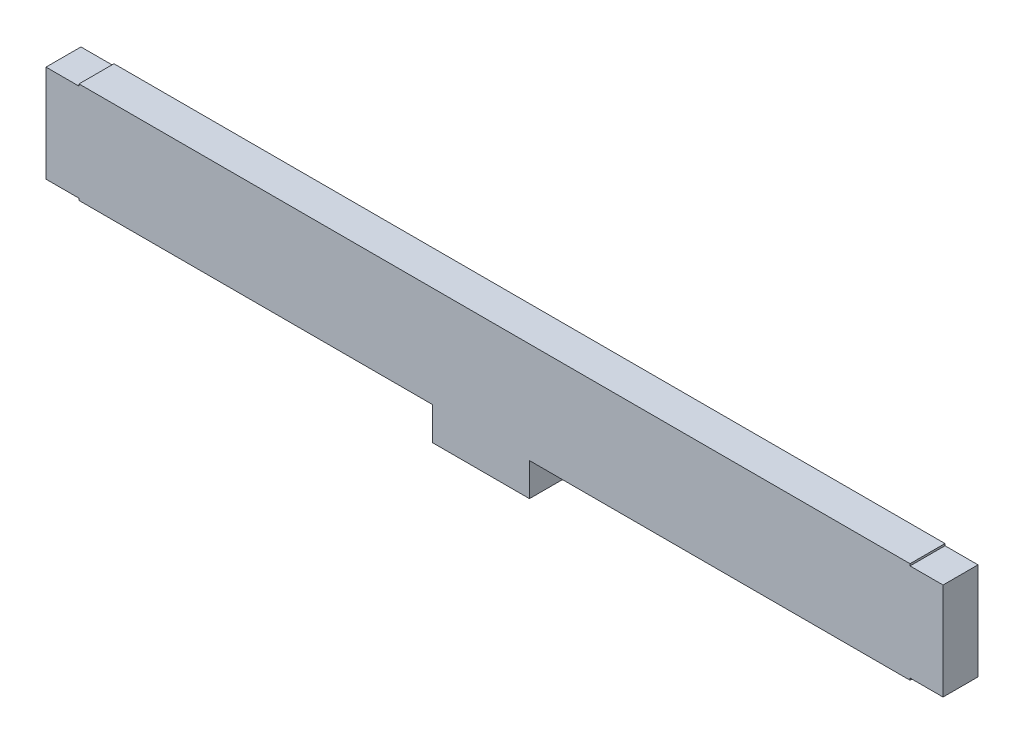
ISO-10303-21;
HEADER;
FILE_DESCRIPTION(('STEP AP214'),'2;1');
FILE_NAME('part.step','',(''),(''),'','','');
FILE_SCHEMA(('AUTOMOTIVE_DESIGN { 1 0 10303 214 1 1 1 1 }'));
ENDSEC;
DATA;
#1=APPLICATION_CONTEXT('core data for automotive mechanical design processes');
#2=APPLICATION_PROTOCOL_DEFINITION('international standard','automotive_design',2000,#1);
#3=PRODUCT_CONTEXT('',#1,'mechanical');
#4=PRODUCT('Part','Part','',(#3));
#5=PRODUCT_RELATED_PRODUCT_CATEGORY('part','',(#4));
#6=PRODUCT_DEFINITION_FORMATION('','',#4);
#7=PRODUCT_DEFINITION_CONTEXT('part definition',#1,'design');
#8=PRODUCT_DEFINITION('design','',#6,#7);
#9=PRODUCT_DEFINITION_SHAPE('','',#8);
#10=(LENGTH_UNIT() NAMED_UNIT(*) SI_UNIT(.MILLI.,.METRE.));
#11=(NAMED_UNIT(*) PLANE_ANGLE_UNIT() SI_UNIT($,.RADIAN.));
#12=(NAMED_UNIT(*) SI_UNIT($,.STERADIAN.) SOLID_ANGLE_UNIT());
#13=UNCERTAINTY_MEASURE_WITH_UNIT(LENGTH_MEASURE(1.E-05),#10,'distance_accuracy_value','');
#14=(GEOMETRIC_REPRESENTATION_CONTEXT(3) GLOBAL_UNCERTAINTY_ASSIGNED_CONTEXT((#13)) GLOBAL_UNIT_ASSIGNED_CONTEXT((#10,
#11,#12)) REPRESENTATION_CONTEXT('',''));
#15=CARTESIAN_POINT('',(0.,0.,0.));
#16=DIRECTION('',(0.,0.,1.));
#17=DIRECTION('',(1.,0.,0.));
#18=AXIS2_PLACEMENT_3D('',#15,#16,#17);
#19=CARTESIAN_POINT('',(0.,0.,18.));
#20=DIRECTION('',(1.,0.,0.));
#21=DIRECTION('',(0.,0.,-1.));
#22=AXIS2_PLACEMENT_3D('',#19,#20,#21);
#23=PLANE('',#22);
#24=DIRECTION('',(0.,-1.,0.));
#25=VECTOR('',#24,1.);
#26=CARTESIAN_POINT('',(0.,0.,0.));
#27=LINE('',#26,#25);
#28=CARTESIAN_POINT('',(0.,0.,0.));
#29=VERTEX_POINT('',#28);
#30=CARTESIAN_POINT('',(0.,-1.00000000000005,0.));
#31=VERTEX_POINT('',#30);
#32=EDGE_CURVE('E179',#29,#31,#27,.T.);
#33=ORIENTED_EDGE('',*,*,#32,.T.);
#34=DIRECTION('',(0.,0.,-1.));
#35=VECTOR('',#34,1.);
#36=CARTESIAN_POINT('',(0.,-1.00000000000005,18.));
#37=LINE('',#36,#35);
#38=CARTESIAN_POINT('',(0.,-1.00000000000005,18.));
#39=VERTEX_POINT('',#38);
#40=EDGE_CURVE('E11',#39,#31,#37,.T.);
#41=ORIENTED_EDGE('',*,*,#40,.F.);
#42=DIRECTION('',(0.,-1.,0.));
#43=VECTOR('',#42,1.);
#44=CARTESIAN_POINT('',(0.,0.,18.));
#45=LINE('',#44,#43);
#46=CARTESIAN_POINT('',(0.,0.,18.));
#47=VERTEX_POINT('',#46);
#48=EDGE_CURVE('E209',#47,#39,#45,.T.);
#49=ORIENTED_EDGE('',*,*,#48,.F.);
#50=DIRECTION('',(0.,0.,-1.));
#51=VECTOR('',#50,1.);
#52=CARTESIAN_POINT('',(0.,0.,18.));
#53=LINE('',#52,#51);
#54=EDGE_CURVE('E175',#47,#29,#53,.T.);
#55=ORIENTED_EDGE('',*,*,#54,.T.);
#56=EDGE_LOOP('',(#33,#41,#49,#55));
#57=FACE_BOUND('',#56,.T.);
#58=ADVANCED_FACE('F35',(#57),#23,.F.);
#59=CARTESIAN_POINT('',(-17.,-1.00000000000005,18.));
#60=DIRECTION('',(0.,-1.,0.));
#61=DIRECTION('',(0.,0.,-1.));
#62=AXIS2_PLACEMENT_3D('',#59,#60,#61);
#63=PLANE('',#62);
#64=DIRECTION('',(-1.,0.,0.));
#65=VECTOR('',#64,1.);
#66=CARTESIAN_POINT('',(-17.,-1.00000000000005,0.));
#67=LINE('',#66,#65);
#68=CARTESIAN_POINT('',(-17.,-1.00000000000005,0.));
#69=VERTEX_POINT('',#68);
#70=EDGE_CURVE('E182',#31,#69,#67,.T.);
#71=ORIENTED_EDGE('',*,*,#70,.T.);
#72=DIRECTION('',(0.,0.,-1.));
#73=VECTOR('',#72,1.);
#74=CARTESIAN_POINT('',(-17.,-1.00000000000005,18.));
#75=LINE('',#74,#73);
#76=CARTESIAN_POINT('',(-17.,-1.00000000000005,18.));
#77=VERTEX_POINT('',#76);
#78=EDGE_CURVE('E43',#77,#69,#75,.T.);
#79=ORIENTED_EDGE('',*,*,#78,.F.);
#80=DIRECTION('',(-1.,0.,0.));
#81=VECTOR('',#80,1.);
#82=CARTESIAN_POINT('',(-17.,-1.00000000000005,18.));
#83=LINE('',#82,#81);
#84=EDGE_CURVE('E118',#39,#77,#83,.T.);
#85=ORIENTED_EDGE('',*,*,#84,.F.);
#86=ORIENTED_EDGE('',*,*,#40,.T.);
#87=EDGE_LOOP('',(#71,#79,#85,#86));
#88=FACE_BOUND('',#87,.T.);
#89=ADVANCED_FACE('F307',(#88),#63,.F.);
#90=CARTESIAN_POINT('',(-17.,-1.00000000000005,18.));
#91=DIRECTION('',(1.,0.,0.));
#92=DIRECTION('',(0.,1.,0.));
#93=AXIS2_PLACEMENT_3D('',#90,#91,#92);
#94=PLANE('',#93);
#95=DIRECTION('',(0.,-1.,0.));
#96=VECTOR('',#95,1.);
#97=CARTESIAN_POINT('',(-17.,-1.00000000000005,0.));
#98=LINE('',#97,#96);
#99=CARTESIAN_POINT('',(-17.,-51.0000000000001,0.));
#100=VERTEX_POINT('',#99);
#101=EDGE_CURVE('E184',#69,#100,#98,.T.);
#102=ORIENTED_EDGE('',*,*,#101,.T.);
#103=DIRECTION('',(0.,0.,-1.));
#104=VECTOR('',#103,1.);
#105=CARTESIAN_POINT('',(-17.,-51.0000000000001,18.));
#106=LINE('',#105,#104);
#107=CARTESIAN_POINT('',(-17.,-51.0000000000001,18.));
#108=VERTEX_POINT('',#107);
#109=EDGE_CURVE('E240',#108,#100,#106,.T.);
#110=ORIENTED_EDGE('',*,*,#109,.F.);
#111=DIRECTION('',(0.,-1.,0.));
#112=VECTOR('',#111,1.);
#113=CARTESIAN_POINT('',(-17.,-1.00000000000005,18.));
#114=LINE('',#113,#112);
#115=EDGE_CURVE('E248',#77,#108,#114,.T.);
#116=ORIENTED_EDGE('',*,*,#115,.F.);
#117=ORIENTED_EDGE('',*,*,#78,.T.);
#118=EDGE_LOOP('',(#102,#110,#116,#117));
#119=FACE_BOUND('',#118,.T.);
#120=ADVANCED_FACE('F246',(#119),#94,.F.);
#121=CARTESIAN_POINT('',(-17.,-51.0000000000001,18.));
#122=DIRECTION('',(0.,1.,0.));
#123=DIRECTION('',(0.,0.,1.));
#124=AXIS2_PLACEMENT_3D('',#121,#122,#123);
#125=PLANE('',#124);
#126=DIRECTION('',(1.,0.,0.));
#127=VECTOR('',#126,1.);
#128=CARTESIAN_POINT('',(-17.,-51.0000000000001,0.));
#129=LINE('',#128,#127);
#130=CARTESIAN_POINT('',(0.,-51.0000000000001,0.));
#131=VERTEX_POINT('',#130);
#132=EDGE_CURVE('E186',#100,#131,#129,.T.);
#133=ORIENTED_EDGE('',*,*,#132,.T.);
#134=DIRECTION('',(0.,0.,-1.));
#135=VECTOR('',#134,1.);
#136=CARTESIAN_POINT('',(0.,-51.0000000000001,18.));
#137=LINE('',#136,#135);
#138=CARTESIAN_POINT('',(0.,-51.0000000000001,18.));
#139=VERTEX_POINT('',#138);
#140=EDGE_CURVE('E237',#139,#131,#137,.T.);
#141=ORIENTED_EDGE('',*,*,#140,.F.);
#142=DIRECTION('',(1.,0.,0.));
#143=VECTOR('',#142,1.);
#144=CARTESIAN_POINT('',(-17.,-51.0000000000001,18.));
#145=LINE('',#144,#143);
#146=EDGE_CURVE('E266',#108,#139,#145,.T.);
#147=ORIENTED_EDGE('',*,*,#146,.F.);
#148=ORIENTED_EDGE('',*,*,#109,.T.);
#149=EDGE_LOOP('',(#133,#141,#147,#148));
#150=FACE_BOUND('',#149,.T.);
#151=ADVANCED_FACE('F257',(#150),#125,.F.);
#152=CARTESIAN_POINT('',(0.,-51.0000000000001,18.));
#153=DIRECTION('',(1.,0.,0.));
#154=DIRECTION('',(0.,1.,0.));
#155=AXIS2_PLACEMENT_3D('',#152,#153,#154);
#156=PLANE('',#155);
#157=DIRECTION('',(0.,-1.,0.));
#158=VECTOR('',#157,1.);
#159=CARTESIAN_POINT('',(0.,-51.0000000000001,0.));
#160=LINE('',#159,#158);
#161=CARTESIAN_POINT('',(0.,-52.,0.));
#162=VERTEX_POINT('',#161);
#163=EDGE_CURVE('E188',#131,#162,#160,.T.);
#164=ORIENTED_EDGE('',*,*,#163,.T.);
#165=DIRECTION('',(0.,0.,-1.));
#166=VECTOR('',#165,1.);
#167=CARTESIAN_POINT('',(0.,-52.,18.));
#168=LINE('',#167,#166);
#169=CARTESIAN_POINT('',(0.,-52.,18.));
#170=VERTEX_POINT('',#169);
#171=EDGE_CURVE('E234',#170,#162,#168,.T.);
#172=ORIENTED_EDGE('',*,*,#171,.F.);
#173=DIRECTION('',(0.,-1.,0.));
#174=VECTOR('',#173,1.);
#175=CARTESIAN_POINT('',(0.,-51.0000000000001,18.));
#176=LINE('',#175,#174);
#177=EDGE_CURVE('E263',#139,#170,#176,.T.);
#178=ORIENTED_EDGE('',*,*,#177,.F.);
#179=ORIENTED_EDGE('',*,*,#140,.T.);
#180=EDGE_LOOP('',(#164,#172,#178,#179));
#181=FACE_BOUND('',#180,.T.);
#182=ADVANCED_FACE('F261',(#181),#156,.F.);
#183=CARTESIAN_POINT('',(182.,-52.,18.));
#184=DIRECTION('',(0.,1.,0.));
#185=DIRECTION('',(-1.,0.,0.));
#186=AXIS2_PLACEMENT_3D('',#183,#184,#185);
#187=PLANE('',#186);
#188=DIRECTION('',(1.,0.,0.));
#189=VECTOR('',#188,1.);
#190=CARTESIAN_POINT('',(182.,-52.,0.));
#191=LINE('',#190,#189);
#192=CARTESIAN_POINT('',(182.,-52.,0.));
#193=VERTEX_POINT('',#192);
#194=EDGE_CURVE('E190',#162,#193,#191,.T.);
#195=ORIENTED_EDGE('',*,*,#194,.T.);
#196=DIRECTION('',(0.,0.,-1.));
#197=VECTOR('',#196,1.);
#198=CARTESIAN_POINT('',(182.,-52.,18.));
#199=LINE('',#198,#197);
#200=CARTESIAN_POINT('',(182.,-52.,18.));
#201=VERTEX_POINT('',#200);
#202=EDGE_CURVE('E231',#201,#193,#199,.T.);
#203=ORIENTED_EDGE('',*,*,#202,.F.);
#204=DIRECTION('',(1.,0.,0.));
#205=VECTOR('',#204,1.);
#206=CARTESIAN_POINT('',(182.,-52.,18.));
#207=LINE('',#206,#205);
#208=EDGE_CURVE('E265',#170,#201,#207,.T.);
#209=ORIENTED_EDGE('',*,*,#208,.F.);
#210=ORIENTED_EDGE('',*,*,#171,.T.);
#211=EDGE_LOOP('',(#195,#203,#209,#210));
#212=FACE_BOUND('',#211,.T.);
#213=ADVANCED_FACE('F320',(#212),#187,.F.);
#214=CARTESIAN_POINT('',(182.,-52.,18.));
#215=DIRECTION('',(1.,0.,0.));
#216=DIRECTION('',(0.,1.,0.));
#217=AXIS2_PLACEMENT_3D('',#214,#215,#216);
#218=PLANE('',#217);
#219=DIRECTION('',(0.,-1.,0.));
#220=VECTOR('',#219,1.);
#221=CARTESIAN_POINT('',(182.,-52.,0.));
#222=LINE('',#221,#220);
#223=CARTESIAN_POINT('',(182.,-68.9999999999999,0.));
#224=VERTEX_POINT('',#223);
#225=EDGE_CURVE('E192',#193,#224,#222,.T.);
#226=ORIENTED_EDGE('',*,*,#225,.T.);
#227=DIRECTION('',(0.,0.,-1.));
#228=VECTOR('',#227,1.);
#229=CARTESIAN_POINT('',(182.,-68.9999999999999,18.));
#230=LINE('',#229,#228);
#231=CARTESIAN_POINT('',(182.,-68.9999999999999,18.));
#232=VERTEX_POINT('',#231);
#233=EDGE_CURVE('E228',#232,#224,#230,.T.);
#234=ORIENTED_EDGE('',*,*,#233,.F.);
#235=DIRECTION('',(0.,-1.,0.));
#236=VECTOR('',#235,1.);
#237=CARTESIAN_POINT('',(182.,-52.,18.));
#238=LINE('',#237,#236);
#239=EDGE_CURVE('E268',#201,#232,#238,.T.);
#240=ORIENTED_EDGE('',*,*,#239,.F.);
#241=ORIENTED_EDGE('',*,*,#202,.T.);
#242=EDGE_LOOP('',(#226,#234,#240,#241));
#243=FACE_BOUND('',#242,.T.);
#244=ADVANCED_FACE('F323',(#243),#218,.F.);
#245=CARTESIAN_POINT('',(182.,-68.9999999999999,18.));
#246=DIRECTION('',(0.,1.,0.));
#247=DIRECTION('',(0.,0.,1.));
#248=AXIS2_PLACEMENT_3D('',#245,#246,#247);
#249=PLANE('',#248);
#250=DIRECTION('',(1.,0.,0.));
#251=VECTOR('',#250,1.);
#252=CARTESIAN_POINT('',(182.,-68.9999999999999,0.));
#253=LINE('',#252,#251);
#254=CARTESIAN_POINT('',(232.,-68.9999999999999,0.));
#255=VERTEX_POINT('',#254);
#256=EDGE_CURVE('E194',#224,#255,#253,.T.);
#257=ORIENTED_EDGE('',*,*,#256,.T.);
#258=DIRECTION('',(0.,0.,-1.));
#259=VECTOR('',#258,1.);
#260=CARTESIAN_POINT('',(232.,-68.9999999999999,18.));
#261=LINE('',#260,#259);
#262=CARTESIAN_POINT('',(232.,-68.9999999999999,18.));
#263=VERTEX_POINT('',#262);
#264=EDGE_CURVE('E225',#263,#255,#261,.T.);
#265=ORIENTED_EDGE('',*,*,#264,.F.);
#266=DIRECTION('',(1.,0.,0.));
#267=VECTOR('',#266,1.);
#268=CARTESIAN_POINT('',(182.,-68.9999999999999,18.));
#269=LINE('',#268,#267);
#270=EDGE_CURVE('E274',#232,#263,#269,.T.);
#271=ORIENTED_EDGE('',*,*,#270,.F.);
#272=ORIENTED_EDGE('',*,*,#233,.T.);
#273=EDGE_LOOP('',(#257,#265,#271,#272));
#274=FACE_BOUND('',#273,.T.);
#275=ADVANCED_FACE('F327',(#274),#249,.F.);
#276=CARTESIAN_POINT('',(232.,-52.,18.));
#277=DIRECTION('',(-1.,0.,0.));
#278=DIRECTION('',(0.,0.,1.));
#279=AXIS2_PLACEMENT_3D('',#276,#277,#278);
#280=PLANE('',#279);
#281=DIRECTION('',(0.,1.,0.));
#282=VECTOR('',#281,1.);
#283=CARTESIAN_POINT('',(232.,-52.,0.));
#284=LINE('',#283,#282);
#285=CARTESIAN_POINT('',(232.,-52.,0.));
#286=VERTEX_POINT('',#285);
#287=EDGE_CURVE('E196',#255,#286,#284,.T.);
#288=ORIENTED_EDGE('',*,*,#287,.T.);
#289=DIRECTION('',(0.,0.,-1.));
#290=VECTOR('',#289,1.);
#291=CARTESIAN_POINT('',(232.,-52.,18.));
#292=LINE('',#291,#290);
#293=CARTESIAN_POINT('',(232.,-52.,18.));
#294=VERTEX_POINT('',#293);
#295=EDGE_CURVE('E222',#294,#286,#292,.T.);
#296=ORIENTED_EDGE('',*,*,#295,.F.);
#297=DIRECTION('',(0.,1.,0.));
#298=VECTOR('',#297,1.);
#299=CARTESIAN_POINT('',(232.,-52.,18.));
#300=LINE('',#299,#298);
#301=EDGE_CURVE('E276',#263,#294,#300,.T.);
#302=ORIENTED_EDGE('',*,*,#301,.F.);
#303=ORIENTED_EDGE('',*,*,#264,.T.);
#304=EDGE_LOOP('',(#288,#296,#302,#303));
#305=FACE_BOUND('',#304,.T.);
#306=ADVANCED_FACE('F331',(#305),#280,.F.);
#307=CARTESIAN_POINT('',(428.,-51.9999999999999,18.));
#308=DIRECTION('',(0.,1.,0.));
#309=DIRECTION('',(-1.,0.,0.));
#310=AXIS2_PLACEMENT_3D('',#307,#308,#309);
#311=PLANE('',#310);
#312=DIRECTION('',(1.,0.,0.));
#313=VECTOR('',#312,1.);
#314=CARTESIAN_POINT('',(428.,-51.9999999999999,0.));
#315=LINE('',#314,#313);
#316=CARTESIAN_POINT('',(428.,-51.9999999999999,0.));
#317=VERTEX_POINT('',#316);
#318=EDGE_CURVE('E198',#286,#317,#315,.T.);
#319=ORIENTED_EDGE('',*,*,#318,.T.);
#320=DIRECTION('',(0.,0.,-1.));
#321=VECTOR('',#320,1.);
#322=CARTESIAN_POINT('',(428.,-51.9999999999999,18.));
#323=LINE('',#322,#321);
#324=CARTESIAN_POINT('',(428.,-51.9999999999999,18.));
#325=VERTEX_POINT('',#324);
#326=EDGE_CURVE('E219',#325,#317,#323,.T.);
#327=ORIENTED_EDGE('',*,*,#326,.F.);
#328=DIRECTION('',(1.,0.,0.));
#329=VECTOR('',#328,1.);
#330=CARTESIAN_POINT('',(428.,-51.9999999999999,18.));
#331=LINE('',#330,#329);
#332=EDGE_CURVE('E278',#294,#325,#331,.T.);
#333=ORIENTED_EDGE('',*,*,#332,.F.);
#334=ORIENTED_EDGE('',*,*,#295,.T.);
#335=EDGE_LOOP('',(#319,#327,#333,#334));
#336=FACE_BOUND('',#335,.T.);
#337=ADVANCED_FACE('F335',(#336),#311,.F.);
#338=CARTESIAN_POINT('',(428.,-51.,18.));
#339=DIRECTION('',(-1.,0.,0.));
#340=DIRECTION('',(0.,0.,1.));
#341=AXIS2_PLACEMENT_3D('',#338,#339,#340);
#342=PLANE('',#341);
#343=DIRECTION('',(0.,1.,0.));
#344=VECTOR('',#343,1.);
#345=CARTESIAN_POINT('',(428.,-51.,0.));
#346=LINE('',#345,#344);
#347=CARTESIAN_POINT('',(428.,-51.,0.));
#348=VERTEX_POINT('',#347);
#349=EDGE_CURVE('E200',#317,#348,#346,.T.);
#350=ORIENTED_EDGE('',*,*,#349,.T.);
#351=DIRECTION('',(0.,0.,-1.));
#352=VECTOR('',#351,1.);
#353=CARTESIAN_POINT('',(428.,-51.,18.));
#354=LINE('',#353,#352);
#355=CARTESIAN_POINT('',(428.,-51.,18.));
#356=VERTEX_POINT('',#355);
#357=EDGE_CURVE('E216',#356,#348,#354,.T.);
#358=ORIENTED_EDGE('',*,*,#357,.F.);
#359=DIRECTION('',(0.,1.,0.));
#360=VECTOR('',#359,1.);
#361=CARTESIAN_POINT('',(428.,-51.,18.));
#362=LINE('',#361,#360);
#363=EDGE_CURVE('E280',#325,#356,#362,.T.);
#364=ORIENTED_EDGE('',*,*,#363,.F.);
#365=ORIENTED_EDGE('',*,*,#326,.T.);
#366=EDGE_LOOP('',(#350,#358,#364,#365));
#367=FACE_BOUND('',#366,.T.);
#368=ADVANCED_FACE('F339',(#367),#342,.F.);
#369=CARTESIAN_POINT('',(445.,-51.,18.));
#370=DIRECTION('',(0.,1.,0.));
#371=DIRECTION('',(0.,0.,1.));
#372=AXIS2_PLACEMENT_3D('',#369,#370,#371);
#373=PLANE('',#372);
#374=DIRECTION('',(1.,0.,0.));
#375=VECTOR('',#374,1.);
#376=CARTESIAN_POINT('',(445.,-51.,0.));
#377=LINE('',#376,#375);
#378=CARTESIAN_POINT('',(445.,-51.,0.));
#379=VERTEX_POINT('',#378);
#380=EDGE_CURVE('E202',#348,#379,#377,.T.);
#381=ORIENTED_EDGE('',*,*,#380,.T.);
#382=DIRECTION('',(0.,0.,-1.));
#383=VECTOR('',#382,1.);
#384=CARTESIAN_POINT('',(445.,-51.,18.));
#385=LINE('',#384,#383);
#386=CARTESIAN_POINT('',(445.,-51.,18.));
#387=VERTEX_POINT('',#386);
#388=EDGE_CURVE('E213',#387,#379,#385,.T.);
#389=ORIENTED_EDGE('',*,*,#388,.F.);
#390=DIRECTION('',(1.,0.,0.));
#391=VECTOR('',#390,1.);
#392=CARTESIAN_POINT('',(445.,-51.,18.));
#393=LINE('',#392,#391);
#394=EDGE_CURVE('E282',#356,#387,#393,.T.);
#395=ORIENTED_EDGE('',*,*,#394,.F.);
#396=ORIENTED_EDGE('',*,*,#357,.T.);
#397=EDGE_LOOP('',(#381,#389,#395,#396));
#398=FACE_BOUND('',#397,.T.);
#399=ADVANCED_FACE('F288',(#398),#373,.F.);
#400=CARTESIAN_POINT('',(445.,-0.999999999999997,18.));
#401=DIRECTION('',(-1.,0.,0.));
#402=DIRECTION('',(0.,-1.,0.));
#403=AXIS2_PLACEMENT_3D('',#400,#401,#402);
#404=PLANE('',#403);
#405=DIRECTION('',(0.,1.,0.));
#406=VECTOR('',#405,1.);
#407=CARTESIAN_POINT('',(445.,-0.999999999999997,0.));
#408=LINE('',#407,#406);
#409=CARTESIAN_POINT('',(445.,-0.999999999999997,0.));
#410=VERTEX_POINT('',#409);
#411=EDGE_CURVE('E204',#379,#410,#408,.T.);
#412=ORIENTED_EDGE('',*,*,#411,.T.);
#413=DIRECTION('',(0.,0.,-1.));
#414=VECTOR('',#413,1.);
#415=CARTESIAN_POINT('',(445.,-0.999999999999997,18.));
#416=LINE('',#415,#414);
#417=CARTESIAN_POINT('',(445.,-0.999999999999997,18.));
#418=VERTEX_POINT('',#417);
#419=EDGE_CURVE('E170',#418,#410,#416,.T.);
#420=ORIENTED_EDGE('',*,*,#419,.F.);
#421=DIRECTION('',(0.,1.,0.));
#422=VECTOR('',#421,1.);
#423=CARTESIAN_POINT('',(445.,-0.999999999999997,18.));
#424=LINE('',#423,#422);
#425=EDGE_CURVE('E161',#387,#418,#424,.T.);
#426=ORIENTED_EDGE('',*,*,#425,.F.);
#427=ORIENTED_EDGE('',*,*,#388,.T.);
#428=EDGE_LOOP('',(#412,#420,#426,#427));
#429=FACE_BOUND('',#428,.T.);
#430=ADVANCED_FACE('F292',(#429),#404,.F.);
#431=CARTESIAN_POINT('',(445.,-0.999999999999997,18.));
#432=DIRECTION('',(0.,-1.,0.));
#433=DIRECTION('',(1.,0.,0.));
#434=AXIS2_PLACEMENT_3D('',#431,#432,#433);
#435=PLANE('',#434);
#436=DIRECTION('',(-1.,0.,0.));
#437=VECTOR('',#436,1.);
#438=CARTESIAN_POINT('',(445.,-0.999999999999997,0.));
#439=LINE('',#438,#437);
#440=CARTESIAN_POINT('',(428.,-1.,0.));
#441=VERTEX_POINT('',#440);
#442=EDGE_CURVE('E169',#410,#441,#439,.T.);
#443=ORIENTED_EDGE('',*,*,#442,.T.);
#444=DIRECTION('',(0.,0.,-1.));
#445=VECTOR('',#444,1.);
#446=CARTESIAN_POINT('',(428.,-1.,18.));
#447=LINE('',#446,#445);
#448=CARTESIAN_POINT('',(428.,-1.,18.));
#449=VERTEX_POINT('',#448);
#450=EDGE_CURVE('E166',#449,#441,#447,.T.);
#451=ORIENTED_EDGE('',*,*,#450,.F.);
#452=DIRECTION('',(-1.,0.,0.));
#453=VECTOR('',#452,1.);
#454=CARTESIAN_POINT('',(445.,-0.999999999999997,18.));
#455=LINE('',#454,#453);
#456=EDGE_CURVE('E155',#418,#449,#455,.T.);
#457=ORIENTED_EDGE('',*,*,#456,.F.);
#458=ORIENTED_EDGE('',*,*,#419,.T.);
#459=EDGE_LOOP('',(#443,#451,#457,#458));
#460=FACE_BOUND('',#459,.T.);
#461=ADVANCED_FACE('F167',(#460),#435,.F.);
#462=CARTESIAN_POINT('',(428.,0.,18.));
#463=DIRECTION('',(-1.,0.,0.));
#464=DIRECTION('',(0.,0.,1.));
#465=AXIS2_PLACEMENT_3D('',#462,#463,#464);
#466=PLANE('',#465);
#467=DIRECTION('',(0.,1.,0.));
#468=VECTOR('',#467,1.);
#469=CARTESIAN_POINT('',(428.,0.,0.));
#470=LINE('',#469,#468);
#471=CARTESIAN_POINT('',(428.,0.,0.));
#472=VERTEX_POINT('',#471);
#473=EDGE_CURVE('E104',#441,#472,#470,.T.);
#474=ORIENTED_EDGE('',*,*,#473,.T.);
#475=DIRECTION('',(0.,0.,-1.));
#476=VECTOR('',#475,1.);
#477=CARTESIAN_POINT('',(428.,0.,18.));
#478=LINE('',#477,#476);
#479=CARTESIAN_POINT('',(428.,0.,18.));
#480=VERTEX_POINT('',#479);
#481=EDGE_CURVE('E171',#480,#472,#478,.T.);
#482=ORIENTED_EDGE('',*,*,#481,.F.);
#483=DIRECTION('',(0.,1.,0.));
#484=VECTOR('',#483,1.);
#485=CARTESIAN_POINT('',(428.,0.,18.));
#486=LINE('',#485,#484);
#487=EDGE_CURVE('E159',#449,#480,#486,.T.);
#488=ORIENTED_EDGE('',*,*,#487,.F.);
#489=ORIENTED_EDGE('',*,*,#450,.T.);
#490=EDGE_LOOP('',(#474,#482,#488,#489));
#491=FACE_BOUND('',#490,.T.);
#492=ADVANCED_FACE('F173',(#491),#466,.F.);
#493=CARTESIAN_POINT('',(0.,0.,18.));
#494=DIRECTION('',(0.,-1.,0.));
#495=DIRECTION('',(1.,0.,0.));
#496=AXIS2_PLACEMENT_3D('',#493,#494,#495);
#497=PLANE('',#496);
#498=DIRECTION('',(-1.,0.,0.));
#499=VECTOR('',#498,1.);
#500=CARTESIAN_POINT('',(0.,0.,0.));
#501=LINE('',#500,#499);
#502=EDGE_CURVE('E110',#472,#29,#501,.T.);
#503=ORIENTED_EDGE('',*,*,#502,.T.);
#504=ORIENTED_EDGE('',*,*,#54,.F.);
#505=DIRECTION('',(-1.,0.,0.));
#506=VECTOR('',#505,1.);
#507=CARTESIAN_POINT('',(0.,0.,18.));
#508=LINE('',#507,#506);
#509=EDGE_CURVE('E51',#480,#47,#508,.T.);
#510=ORIENTED_EDGE('',*,*,#509,.F.);
#511=ORIENTED_EDGE('',*,*,#481,.T.);
#512=EDGE_LOOP('',(#503,#504,#510,#511));
#513=FACE_BOUND('',#512,.T.);
#514=ADVANCED_FACE('F296',(#513),#497,.F.);
#515=CARTESIAN_POINT('',(0.,0.,18.));
#516=DIRECTION('',(0.,0.,1.));
#517=DIRECTION('',(1.,0.,0.));
#518=AXIS2_PLACEMENT_3D('',#515,#516,#517);
#519=PLANE('',#518);
#520=ORIENTED_EDGE('',*,*,#48,.T.);
#521=ORIENTED_EDGE('',*,*,#84,.T.);
#522=ORIENTED_EDGE('',*,*,#115,.T.);
#523=ORIENTED_EDGE('',*,*,#146,.T.);
#524=ORIENTED_EDGE('',*,*,#177,.T.);
#525=ORIENTED_EDGE('',*,*,#208,.T.);
#526=ORIENTED_EDGE('',*,*,#239,.T.);
#527=ORIENTED_EDGE('',*,*,#270,.T.);
#528=ORIENTED_EDGE('',*,*,#301,.T.);
#529=ORIENTED_EDGE('',*,*,#332,.T.);
#530=ORIENTED_EDGE('',*,*,#363,.T.);
#531=ORIENTED_EDGE('',*,*,#394,.T.);
#532=ORIENTED_EDGE('',*,*,#425,.T.);
#533=ORIENTED_EDGE('',*,*,#456,.T.);
#534=ORIENTED_EDGE('',*,*,#487,.T.);
#535=ORIENTED_EDGE('',*,*,#509,.T.);
#536=EDGE_LOOP('',(#520,#521,#522,#523,#524,#525,#526,#527,#528,#529,#530,#531,#532,#533,#534,#535));
#537=FACE_BOUND('',#536,.T.);
#538=ADVANCED_FACE('F157',(#537),#519,.T.);
#539=CARTESIAN_POINT('',(0.,0.,0.));
#540=DIRECTION('',(0.,0.,1.));
#541=DIRECTION('',(1.,0.,0.));
#542=AXIS2_PLACEMENT_3D('',#539,#540,#541);
#543=PLANE('',#542);
#544=ORIENTED_EDGE('',*,*,#32,.F.);
#545=ORIENTED_EDGE('',*,*,#502,.F.);
#546=ORIENTED_EDGE('',*,*,#473,.F.);
#547=ORIENTED_EDGE('',*,*,#442,.F.);
#548=ORIENTED_EDGE('',*,*,#411,.F.);
#549=ORIENTED_EDGE('',*,*,#380,.F.);
#550=ORIENTED_EDGE('',*,*,#349,.F.);
#551=ORIENTED_EDGE('',*,*,#318,.F.);
#552=ORIENTED_EDGE('',*,*,#287,.F.);
#553=ORIENTED_EDGE('',*,*,#256,.F.);
#554=ORIENTED_EDGE('',*,*,#225,.F.);
#555=ORIENTED_EDGE('',*,*,#194,.F.);
#556=ORIENTED_EDGE('',*,*,#163,.F.);
#557=ORIENTED_EDGE('',*,*,#132,.F.);
#558=ORIENTED_EDGE('',*,*,#101,.F.);
#559=ORIENTED_EDGE('',*,*,#70,.F.);
#560=EDGE_LOOP('',(#544,#545,#546,#547,#548,#549,#550,#551,#552,#553,#554,#555,#556,#557,#558,#559));
#561=FACE_BOUND('',#560,.T.);
#562=ADVANCED_FACE('F252',(#561),#543,.F.);
#563=CLOSED_SHELL('',(#58,#89,#120,#151,#182,#213,#244,#275,#306,#337,#368,#399,#430,#461,#492,
#514,#538,#562));
#564=MANIFOLD_SOLID_BREP('B2',#563);
#565=ADVANCED_BREP_SHAPE_REPRESENTATION('',(#18,#564),#14);
#566=SHAPE_DEFINITION_REPRESENTATION(#9,#565);
ENDSEC;
END-ISO-10303-21;
